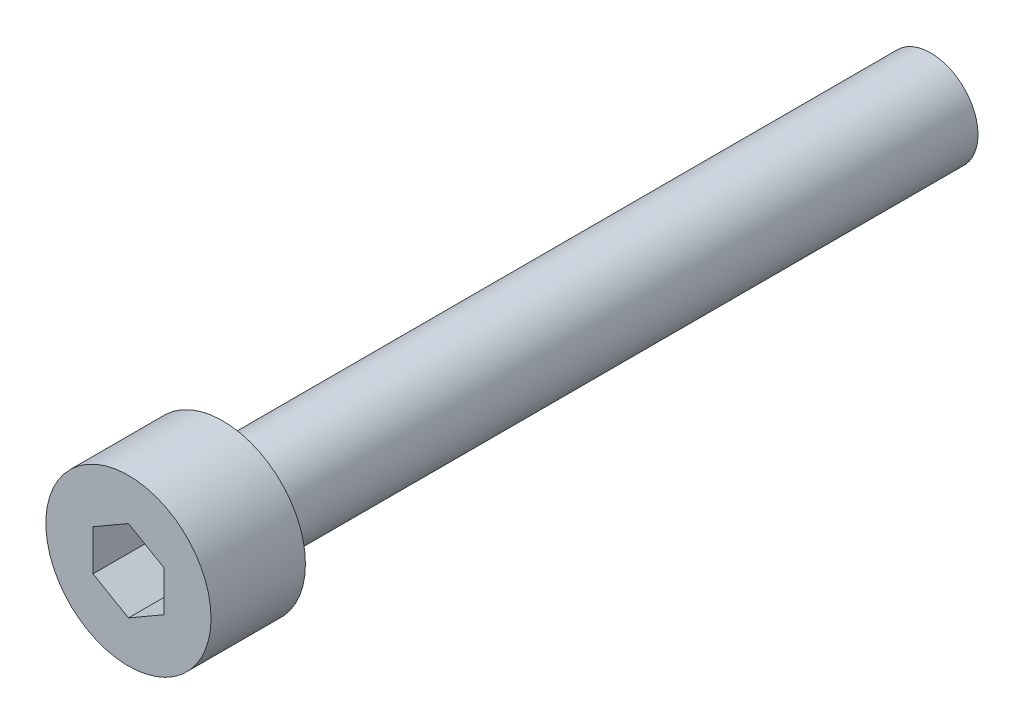
ISO-10303-21;
HEADER;
FILE_DESCRIPTION(('STEP AP214'),'2;1');
FILE_NAME('part.step','',(''),(''),'','','');
FILE_SCHEMA(('AUTOMOTIVE_DESIGN { 1 0 10303 214 1 1 1 1 }'));
ENDSEC;
DATA;
#1=APPLICATION_CONTEXT('core data for automotive mechanical design processes');
#2=APPLICATION_PROTOCOL_DEFINITION('international standard','automotive_design',2000,#1);
#3=PRODUCT_CONTEXT('',#1,'mechanical');
#4=PRODUCT('Part','Part','',(#3));
#5=PRODUCT_RELATED_PRODUCT_CATEGORY('part','',(#4));
#6=PRODUCT_DEFINITION_FORMATION('','',#4);
#7=PRODUCT_DEFINITION_CONTEXT('part definition',#1,'design');
#8=PRODUCT_DEFINITION('design','',#6,#7);
#9=PRODUCT_DEFINITION_SHAPE('','',#8);
#10=(LENGTH_UNIT() NAMED_UNIT(*) SI_UNIT(.MILLI.,.METRE.));
#11=(NAMED_UNIT(*) PLANE_ANGLE_UNIT() SI_UNIT($,.RADIAN.));
#12=(NAMED_UNIT(*) SI_UNIT($,.STERADIAN.) SOLID_ANGLE_UNIT());
#13=UNCERTAINTY_MEASURE_WITH_UNIT(LENGTH_MEASURE(1.E-05),#10,'distance_accuracy_value','');
#14=(GEOMETRIC_REPRESENTATION_CONTEXT(3) GLOBAL_UNCERTAINTY_ASSIGNED_CONTEXT((#13)) GLOBAL_UNIT_ASSIGNED_CONTEXT((#10,
#11,#12)) REPRESENTATION_CONTEXT('',''));
#15=CARTESIAN_POINT('',(0.,0.,0.));
#16=DIRECTION('',(0.,0.,1.));
#17=DIRECTION('',(1.,0.,0.));
#18=AXIS2_PLACEMENT_3D('',#15,#16,#17);
#19=CARTESIAN_POINT('',(0.,0.,0.));
#20=DIRECTION('',(0.,0.,-1.));
#21=DIRECTION('',(-1.,0.,0.));
#22=AXIS2_PLACEMENT_3D('',#19,#20,#21);
#23=CYLINDRICAL_SURFACE('',#22,2.);
#24=CARTESIAN_POINT('',(0.,0.,0.));
#25=DIRECTION('',(0.,0.,1.));
#26=DIRECTION('',(1.,0.,0.));
#27=AXIS2_PLACEMENT_3D('',#24,#25,#26);
#28=CIRCLE('',#27,2.);
#29=CARTESIAN_POINT('',(2.,0.,0.));
#30=VERTEX_POINT('',#29);
#31=EDGE_CURVE('E11',#30,#30,#28,.T.);
#32=ORIENTED_EDGE('',*,*,#31,.F.);
#33=EDGE_LOOP('',(#32));
#34=FACE_BOUND('',#33,.T.);
#35=CARTESIAN_POINT('',(0.,0.,-30.));
#36=DIRECTION('',(0.,0.,1.));
#37=DIRECTION('',(1.,0.,0.));
#38=AXIS2_PLACEMENT_3D('',#35,#36,#37);
#39=CIRCLE('',#38,2.);
#40=CARTESIAN_POINT('',(2.,0.,-30.));
#41=VERTEX_POINT('',#40);
#42=EDGE_CURVE('E46',#41,#41,#39,.T.);
#43=ORIENTED_EDGE('',*,*,#42,.T.);
#44=EDGE_LOOP('',(#43));
#45=FACE_BOUND('',#44,.T.);
#46=ADVANCED_FACE('F43',(#34,#45),#23,.T.);
#47=CARTESIAN_POINT('',(0.,0.,-30.));
#48=DIRECTION('',(0.,0.,1.));
#49=DIRECTION('',(1.,0.,0.));
#50=AXIS2_PLACEMENT_3D('',#47,#48,#49);
#51=PLANE('',#50);
#52=ORIENTED_EDGE('',*,*,#42,.F.);
#53=EDGE_LOOP('',(#52));
#54=FACE_BOUND('',#53,.T.);
#55=ADVANCED_FACE('F164',(#54),#51,.F.);
#56=CARTESIAN_POINT('',(0.,0.,4.));
#57=DIRECTION('',(0.,0.,1.));
#58=DIRECTION('',(1.,0.,0.));
#59=AXIS2_PLACEMENT_3D('',#56,#57,#58);
#60=PLANE('',#59);
#61=CARTESIAN_POINT('',(0.,0.,4.));
#62=DIRECTION('',(0.,0.,1.));
#63=DIRECTION('',(1.,0.,0.));
#64=AXIS2_PLACEMENT_3D('',#61,#62,#63);
#65=CIRCLE('',#64,3.5);
#66=CARTESIAN_POINT('',(3.5,0.,4.));
#67=VERTEX_POINT('',#66);
#68=EDGE_CURVE('E146',#67,#67,#65,.T.);
#69=ORIENTED_EDGE('',*,*,#68,.T.);
#70=EDGE_LOOP('',(#69));
#71=FACE_BOUND('',#70,.T.);
#72=DIRECTION('',(-0.866025403784439,0.5,0.));
#73=VECTOR('',#72,1.);
#74=CARTESIAN_POINT('',(1.5,0.866025403784439,4.));
#75=LINE('',#74,#73);
#76=CARTESIAN_POINT('',(1.5,0.866025403784439,4.));
#77=VERTEX_POINT('',#76);
#78=CARTESIAN_POINT('',(0.,1.73205080756888,4.));
#79=VERTEX_POINT('',#78);
#80=EDGE_CURVE('E103',#77,#79,#75,.T.);
#81=ORIENTED_EDGE('',*,*,#80,.F.);
#82=DIRECTION('',(0.,1.,0.));
#83=VECTOR('',#82,1.);
#84=CARTESIAN_POINT('',(1.5,-0.866025403784439,4.));
#85=LINE('',#84,#83);
#86=CARTESIAN_POINT('',(1.5,-0.866025403784439,4.));
#87=VERTEX_POINT('',#86);
#88=EDGE_CURVE('E94',#87,#77,#85,.T.);
#89=ORIENTED_EDGE('',*,*,#88,.F.);
#90=DIRECTION('',(0.866025403784439,0.5,0.));
#91=VECTOR('',#90,1.);
#92=CARTESIAN_POINT('',(0.,-1.73205080756888,4.));
#93=LINE('',#92,#91);
#94=CARTESIAN_POINT('',(0.,-1.73205080756888,4.));
#95=VERTEX_POINT('',#94);
#96=EDGE_CURVE('E124',#95,#87,#93,.T.);
#97=ORIENTED_EDGE('',*,*,#96,.F.);
#98=DIRECTION('',(0.866025403784439,-0.5,0.));
#99=VECTOR('',#98,1.);
#100=CARTESIAN_POINT('',(-1.5,-0.866025403784439,4.));
#101=LINE('',#100,#99);
#102=CARTESIAN_POINT('',(-1.5,-0.866025403784439,4.));
#103=VERTEX_POINT('',#102);
#104=EDGE_CURVE('E121',#103,#95,#101,.T.);
#105=ORIENTED_EDGE('',*,*,#104,.F.);
#106=DIRECTION('',(0.,-1.,0.));
#107=VECTOR('',#106,1.);
#108=CARTESIAN_POINT('',(-1.5,0.866025403784439,4.));
#109=LINE('',#108,#107);
#110=CARTESIAN_POINT('',(-1.5,0.866025403784439,4.));
#111=VERTEX_POINT('',#110);
#112=EDGE_CURVE('E117',#111,#103,#109,.T.);
#113=ORIENTED_EDGE('',*,*,#112,.F.);
#114=DIRECTION('',(-0.866025403784439,-0.5,0.));
#115=VECTOR('',#114,1.);
#116=CARTESIAN_POINT('',(0.,1.73205080756888,4.));
#117=LINE('',#116,#115);
#118=EDGE_CURVE('E115',#79,#111,#117,.T.);
#119=ORIENTED_EDGE('',*,*,#118,.F.);
#120=EDGE_LOOP('',(#81,#89,#97,#105,#113,#119));
#121=FACE_BOUND('',#120,.T.);
#122=ADVANCED_FACE('F113',(#71,#121),#60,.T.);
#123=CARTESIAN_POINT('',(0.,0.,0.));
#124=DIRECTION('',(0.,0.,1.));
#125=DIRECTION('',(1.,0.,0.));
#126=AXIS2_PLACEMENT_3D('',#123,#124,#125);
#127=PLANE('',#126);
#128=ORIENTED_EDGE('',*,*,#31,.T.);
#129=EDGE_LOOP('',(#128));
#130=FACE_BOUND('',#129,.T.);
#131=CARTESIAN_POINT('',(0.,0.,0.));
#132=DIRECTION('',(0.,0.,1.));
#133=DIRECTION('',(1.,0.,0.));
#134=AXIS2_PLACEMENT_3D('',#131,#132,#133);
#135=CIRCLE('',#134,3.5);
#136=CARTESIAN_POINT('',(3.5,0.,0.));
#137=VERTEX_POINT('',#136);
#138=EDGE_CURVE('E109',#137,#137,#135,.T.);
#139=ORIENTED_EDGE('',*,*,#138,.F.);
#140=EDGE_LOOP('',(#139));
#141=FACE_BOUND('',#140,.T.);
#142=ADVANCED_FACE('F154',(#130,#141),#127,.F.);
#143=CARTESIAN_POINT('',(0.,0.,4.));
#144=DIRECTION('',(0.,0.,-1.));
#145=DIRECTION('',(-1.,0.,0.));
#146=AXIS2_PLACEMENT_3D('',#143,#144,#145);
#147=CYLINDRICAL_SURFACE('',#146,3.5);
#148=ORIENTED_EDGE('',*,*,#68,.F.);
#149=EDGE_LOOP('',(#148));
#150=FACE_BOUND('',#149,.T.);
#151=ORIENTED_EDGE('',*,*,#138,.T.);
#152=EDGE_LOOP('',(#151));
#153=FACE_BOUND('',#152,.T.);
#154=ADVANCED_FACE('F152',(#150,#153),#147,.T.);
#155=CARTESIAN_POINT('',(1.5,-0.866025403784439,4.));
#156=DIRECTION('',(-1.,0.,0.));
#157=DIRECTION('',(0.,-1.,0.));
#158=AXIS2_PLACEMENT_3D('',#155,#156,#157);
#159=PLANE('',#158);
#160=DIRECTION('',(0.,1.,0.));
#161=VECTOR('',#160,1.);
#162=CARTESIAN_POINT('',(1.5,-0.866025403784439,0.));
#163=LINE('',#162,#161);
#164=CARTESIAN_POINT('',(1.5,-0.866025403784439,0.));
#165=VERTEX_POINT('',#164);
#166=CARTESIAN_POINT('',(1.5,0.866025403784439,0.));
#167=VERTEX_POINT('',#166);
#168=EDGE_CURVE('E57',#165,#167,#163,.T.);
#169=ORIENTED_EDGE('',*,*,#168,.F.);
#170=DIRECTION('',(0.,0.,-1.));
#171=VECTOR('',#170,1.);
#172=CARTESIAN_POINT('',(1.5,-0.866025403784439,4.));
#173=LINE('',#172,#171);
#174=EDGE_CURVE('E99',#87,#165,#173,.T.);
#175=ORIENTED_EDGE('',*,*,#174,.F.);
#176=ORIENTED_EDGE('',*,*,#88,.T.);
#177=DIRECTION('',(0.,0.,-1.));
#178=VECTOR('',#177,1.);
#179=CARTESIAN_POINT('',(1.5,0.866025403784439,4.));
#180=LINE('',#179,#178);
#181=EDGE_CURVE('E97',#77,#167,#180,.T.);
#182=ORIENTED_EDGE('',*,*,#181,.T.);
#183=EDGE_LOOP('',(#169,#175,#176,#182));
#184=FACE_BOUND('',#183,.T.);
#185=ADVANCED_FACE('F96',(#184),#159,.T.);
#186=CARTESIAN_POINT('',(1.5,0.866025403784439,4.));
#187=DIRECTION('',(-0.5,-0.866025403784439,0.));
#188=DIRECTION('',(0.866025403784439,-0.5,0.));
#189=AXIS2_PLACEMENT_3D('',#186,#187,#188);
#190=PLANE('',#189);
#191=DIRECTION('',(-0.866025403784439,0.5,0.));
#192=VECTOR('',#191,1.);
#193=CARTESIAN_POINT('',(1.5,0.866025403784439,0.));
#194=LINE('',#193,#192);
#195=CARTESIAN_POINT('',(0.,1.73205080756888,0.));
#196=VERTEX_POINT('',#195);
#197=EDGE_CURVE('E61',#167,#196,#194,.T.);
#198=ORIENTED_EDGE('',*,*,#197,.F.);
#199=ORIENTED_EDGE('',*,*,#181,.F.);
#200=ORIENTED_EDGE('',*,*,#80,.T.);
#201=DIRECTION('',(0.,0.,-1.));
#202=VECTOR('',#201,1.);
#203=CARTESIAN_POINT('',(0.,1.73205080756888,4.));
#204=LINE('',#203,#202);
#205=EDGE_CURVE('E110',#79,#196,#204,.T.);
#206=ORIENTED_EDGE('',*,*,#205,.T.);
#207=EDGE_LOOP('',(#198,#199,#200,#206));
#208=FACE_BOUND('',#207,.T.);
#209=ADVANCED_FACE('F107',(#208),#190,.T.);
#210=CARTESIAN_POINT('',(0.,1.73205080756888,4.));
#211=DIRECTION('',(0.5,-0.866025403784439,0.));
#212=DIRECTION('',(0.866025403784439,0.5,0.));
#213=AXIS2_PLACEMENT_3D('',#210,#211,#212);
#214=PLANE('',#213);
#215=DIRECTION('',(-0.866025403784439,-0.5,0.));
#216=VECTOR('',#215,1.);
#217=CARTESIAN_POINT('',(0.,1.73205080756888,0.));
#218=LINE('',#217,#216);
#219=CARTESIAN_POINT('',(-1.5,0.866025403784439,0.));
#220=VERTEX_POINT('',#219);
#221=EDGE_CURVE('E128',#196,#220,#218,.T.);
#222=ORIENTED_EDGE('',*,*,#221,.F.);
#223=ORIENTED_EDGE('',*,*,#205,.F.);
#224=ORIENTED_EDGE('',*,*,#118,.T.);
#225=DIRECTION('',(0.,0.,-1.));
#226=VECTOR('',#225,1.);
#227=CARTESIAN_POINT('',(-1.5,0.866025403784439,4.));
#228=LINE('',#227,#226);
#229=EDGE_CURVE('E142',#111,#220,#228,.T.);
#230=ORIENTED_EDGE('',*,*,#229,.T.);
#231=EDGE_LOOP('',(#222,#223,#224,#230));
#232=FACE_BOUND('',#231,.T.);
#233=ADVANCED_FACE('F199',(#232),#214,.T.);
#234=CARTESIAN_POINT('',(-1.5,0.866025403784439,4.));
#235=DIRECTION('',(1.,0.,0.));
#236=DIRECTION('',(0.,1.,0.));
#237=AXIS2_PLACEMENT_3D('',#234,#235,#236);
#238=PLANE('',#237);
#239=DIRECTION('',(0.,-1.,0.));
#240=VECTOR('',#239,1.);
#241=CARTESIAN_POINT('',(-1.5,0.866025403784439,0.));
#242=LINE('',#241,#240);
#243=CARTESIAN_POINT('',(-1.5,-0.866025403784439,0.));
#244=VERTEX_POINT('',#243);
#245=EDGE_CURVE('E130',#220,#244,#242,.T.);
#246=ORIENTED_EDGE('',*,*,#245,.F.);
#247=ORIENTED_EDGE('',*,*,#229,.F.);
#248=ORIENTED_EDGE('',*,*,#112,.T.);
#249=DIRECTION('',(0.,0.,-1.));
#250=VECTOR('',#249,1.);
#251=CARTESIAN_POINT('',(-1.5,-0.866025403784439,4.));
#252=LINE('',#251,#250);
#253=EDGE_CURVE('E139',#103,#244,#252,.T.);
#254=ORIENTED_EDGE('',*,*,#253,.T.);
#255=EDGE_LOOP('',(#246,#247,#248,#254));
#256=FACE_BOUND('',#255,.T.);
#257=ADVANCED_FACE('F192',(#256),#238,.T.);
#258=CARTESIAN_POINT('',(-1.5,-0.866025403784439,4.));
#259=DIRECTION('',(0.5,0.866025403784439,0.));
#260=DIRECTION('',(-0.866025403784439,0.5,0.));
#261=AXIS2_PLACEMENT_3D('',#258,#259,#260);
#262=PLANE('',#261);
#263=DIRECTION('',(0.866025403784439,-0.5,0.));
#264=VECTOR('',#263,1.);
#265=CARTESIAN_POINT('',(-1.5,-0.866025403784439,0.));
#266=LINE('',#265,#264);
#267=CARTESIAN_POINT('',(0.,-1.73205080756888,0.));
#268=VERTEX_POINT('',#267);
#269=EDGE_CURVE('E132',#244,#268,#266,.T.);
#270=ORIENTED_EDGE('',*,*,#269,.F.);
#271=ORIENTED_EDGE('',*,*,#253,.F.);
#272=ORIENTED_EDGE('',*,*,#104,.T.);
#273=DIRECTION('',(0.,0.,-1.));
#274=VECTOR('',#273,1.);
#275=CARTESIAN_POINT('',(0.,-1.73205080756888,4.));
#276=LINE('',#275,#274);
#277=EDGE_CURVE('E136',#95,#268,#276,.T.);
#278=ORIENTED_EDGE('',*,*,#277,.T.);
#279=EDGE_LOOP('',(#270,#271,#272,#278));
#280=FACE_BOUND('',#279,.T.);
#281=ADVANCED_FACE('F186',(#280),#262,.T.);
#282=CARTESIAN_POINT('',(0.,-1.73205080756888,4.));
#283=DIRECTION('',(-0.5,0.866025403784439,0.));
#284=DIRECTION('',(-0.866025403784439,-0.5,0.));
#285=AXIS2_PLACEMENT_3D('',#282,#283,#284);
#286=PLANE('',#285);
#287=DIRECTION('',(0.866025403784439,0.5,0.));
#288=VECTOR('',#287,1.);
#289=CARTESIAN_POINT('',(0.,-1.73205080756888,0.));
#290=LINE('',#289,#288);
#291=EDGE_CURVE('E104',#268,#165,#290,.T.);
#292=ORIENTED_EDGE('',*,*,#291,.F.);
#293=ORIENTED_EDGE('',*,*,#277,.F.);
#294=ORIENTED_EDGE('',*,*,#96,.T.);
#295=ORIENTED_EDGE('',*,*,#174,.T.);
#296=EDGE_LOOP('',(#292,#293,#294,#295));
#297=FACE_BOUND('',#296,.T.);
#298=ADVANCED_FACE('F182',(#297),#286,.T.);
#299=CARTESIAN_POINT('',(0.,0.,0.));
#300=DIRECTION('',(0.,0.,1.));
#301=DIRECTION('',(1.,0.,0.));
#302=AXIS2_PLACEMENT_3D('',#299,#300,#301);
#303=PLANE('',#302);
#304=ORIENTED_EDGE('',*,*,#168,.T.);
#305=ORIENTED_EDGE('',*,*,#197,.T.);
#306=ORIENTED_EDGE('',*,*,#221,.T.);
#307=ORIENTED_EDGE('',*,*,#245,.T.);
#308=ORIENTED_EDGE('',*,*,#269,.T.);
#309=ORIENTED_EDGE('',*,*,#291,.T.);
#310=EDGE_LOOP('',(#304,#305,#306,#307,#308,#309));
#311=FACE_BOUND('',#310,.T.);
#312=ADVANCED_FACE('F180',(#311),#303,.T.);
#313=CLOSED_SHELL('',(#46,#55,#122,#142,#154,#185,#209,#233,#257,#281,#298,#312));
#314=MANIFOLD_SOLID_BREP('B2',#313);
#315=ADVANCED_BREP_SHAPE_REPRESENTATION('',(#18,#314),#14);
#316=SHAPE_DEFINITION_REPRESENTATION(#9,#315);
ENDSEC;
END-ISO-10303-21;
